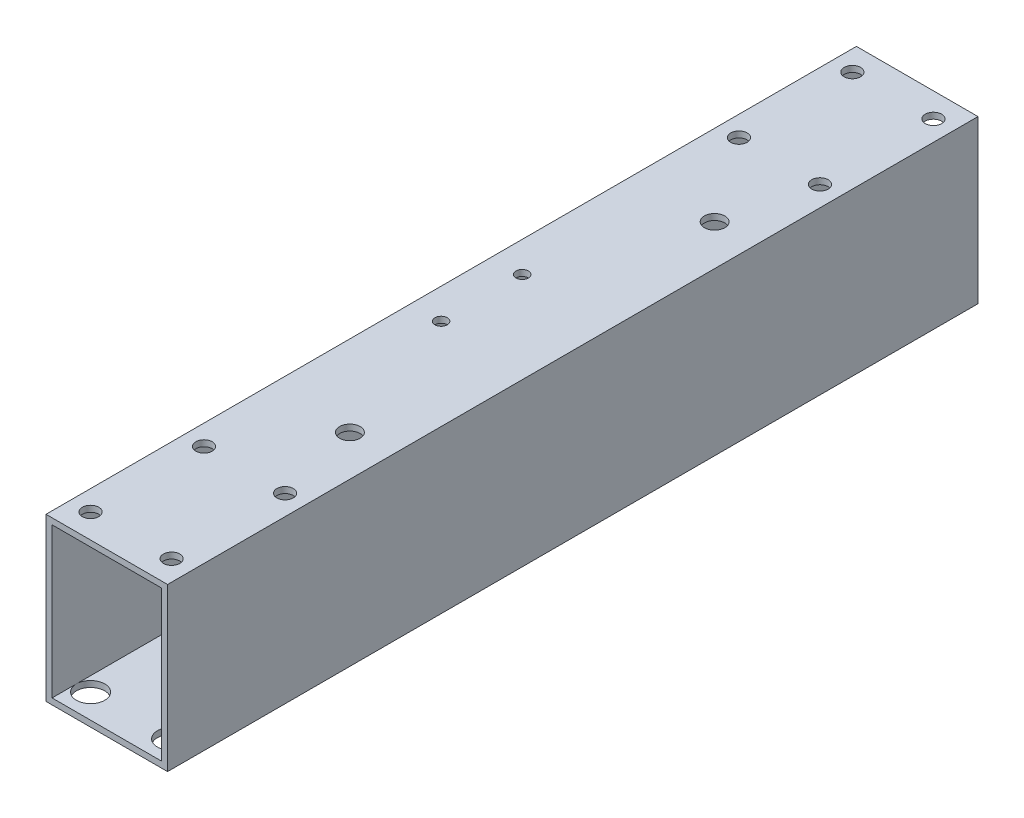
ISO-10303-21;
HEADER;
FILE_DESCRIPTION(('STEP AP214'),'2;1');
FILE_NAME('part.step','',(''),(''),'','','');
FILE_SCHEMA(('AUTOMOTIVE_DESIGN { 1 0 10303 214 1 1 1 1 }'));
ENDSEC;
DATA;
#1=APPLICATION_CONTEXT('core data for automotive mechanical design processes');
#2=APPLICATION_PROTOCOL_DEFINITION('international standard','automotive_design',2000,#1);
#3=PRODUCT_CONTEXT('',#1,'mechanical');
#4=PRODUCT('Part','Part','',(#3));
#5=PRODUCT_RELATED_PRODUCT_CATEGORY('part','',(#4));
#6=PRODUCT_DEFINITION_FORMATION('','',#4);
#7=PRODUCT_DEFINITION_CONTEXT('part definition',#1,'design');
#8=PRODUCT_DEFINITION('design','',#6,#7);
#9=PRODUCT_DEFINITION_SHAPE('','',#8);
#10=(LENGTH_UNIT() NAMED_UNIT(*) SI_UNIT(.MILLI.,.METRE.));
#11=(NAMED_UNIT(*) PLANE_ANGLE_UNIT() SI_UNIT($,.RADIAN.));
#12=(NAMED_UNIT(*) SI_UNIT($,.STERADIAN.) SOLID_ANGLE_UNIT());
#13=UNCERTAINTY_MEASURE_WITH_UNIT(LENGTH_MEASURE(1.E-05),#10,'distance_accuracy_value','');
#14=(GEOMETRIC_REPRESENTATION_CONTEXT(3) GLOBAL_UNCERTAINTY_ASSIGNED_CONTEXT((#13)) GLOBAL_UNIT_ASSIGNED_CONTEXT((#10,
#11,#12)) REPRESENTATION_CONTEXT('',''));
#15=CARTESIAN_POINT('',(0.,0.,0.));
#16=DIRECTION('',(0.,0.,1.));
#17=DIRECTION('',(1.,0.,0.));
#18=AXIS2_PLACEMENT_3D('',#15,#16,#17);
#19=CARTESIAN_POINT('',(0.,0.,100.));
#20=DIRECTION('',(0.,0.,-1.));
#21=DIRECTION('',(-1.,0.,0.));
#22=AXIS2_PLACEMENT_3D('',#19,#20,#21);
#23=PLANE('',#22);
#24=DIRECTION('',(0.,1.,0.));
#25=VECTOR('',#24,1.);
#26=CARTESIAN_POINT('',(15.,-20.,100.));
#27=LINE('',#26,#25);
#28=CARTESIAN_POINT('',(15.,-20.,100.));
#29=VERTEX_POINT('',#28);
#30=CARTESIAN_POINT('',(15.,20.,100.));
#31=VERTEX_POINT('',#30);
#32=EDGE_CURVE('E180',#29,#31,#27,.T.);
#33=ORIENTED_EDGE('',*,*,#32,.T.);
#34=DIRECTION('',(-1.,0.,0.));
#35=VECTOR('',#34,1.);
#36=CARTESIAN_POINT('',(-15.,20.,100.));
#37=LINE('',#36,#35);
#38=CARTESIAN_POINT('',(-15.,20.,100.));
#39=VERTEX_POINT('',#38);
#40=EDGE_CURVE('E183',#31,#39,#37,.T.);
#41=ORIENTED_EDGE('',*,*,#40,.T.);
#42=DIRECTION('',(0.,-1.,0.));
#43=VECTOR('',#42,1.);
#44=CARTESIAN_POINT('',(-15.,-20.,100.));
#45=LINE('',#44,#43);
#46=CARTESIAN_POINT('',(-15.,-20.,100.));
#47=VERTEX_POINT('',#46);
#48=EDGE_CURVE('E186',#39,#47,#45,.T.);
#49=ORIENTED_EDGE('',*,*,#48,.T.);
#50=DIRECTION('',(1.,0.,0.));
#51=VECTOR('',#50,1.);
#52=CARTESIAN_POINT('',(-15.,-20.,100.));
#53=LINE('',#52,#51);
#54=EDGE_CURVE('E188',#47,#29,#53,.T.);
#55=ORIENTED_EDGE('',*,*,#54,.T.);
#56=EDGE_LOOP('',(#33,#41,#49,#55));
#57=FACE_BOUND('',#56,.T.);
#58=DIRECTION('',(1.,0.,0.));
#59=VECTOR('',#58,1.);
#60=CARTESIAN_POINT('',(-13.5,-18.5,100.));
#61=LINE('',#60,#59);
#62=CARTESIAN_POINT('',(-13.5,-18.5,100.));
#63=VERTEX_POINT('',#62);
#64=CARTESIAN_POINT('',(13.5,-18.5,100.));
#65=VERTEX_POINT('',#64);
#66=EDGE_CURVE('E127',#63,#65,#61,.T.);
#67=ORIENTED_EDGE('',*,*,#66,.F.);
#68=DIRECTION('',(0.,-1.,0.));
#69=VECTOR('',#68,1.);
#70=CARTESIAN_POINT('',(-13.5,-18.5,100.));
#71=LINE('',#70,#69);
#72=CARTESIAN_POINT('',(-13.5,18.5,100.));
#73=VERTEX_POINT('',#72);
#74=EDGE_CURVE('E156',#73,#63,#71,.T.);
#75=ORIENTED_EDGE('',*,*,#74,.F.);
#76=DIRECTION('',(-1.,0.,0.));
#77=VECTOR('',#76,1.);
#78=CARTESIAN_POINT('',(-13.5,18.5,100.));
#79=LINE('',#78,#77);
#80=CARTESIAN_POINT('',(13.5,18.5,100.));
#81=VERTEX_POINT('',#80);
#82=EDGE_CURVE('E154',#81,#73,#79,.T.);
#83=ORIENTED_EDGE('',*,*,#82,.F.);
#84=DIRECTION('',(0.,1.,0.));
#85=VECTOR('',#84,1.);
#86=CARTESIAN_POINT('',(13.5,-18.5,100.));
#87=LINE('',#86,#85);
#88=EDGE_CURVE('E139',#65,#81,#87,.T.);
#89=ORIENTED_EDGE('',*,*,#88,.F.);
#90=EDGE_LOOP('',(#67,#75,#83,#89));
#91=FACE_BOUND('',#90,.T.);
#92=ADVANCED_FACE('F37',(#57,#91),#23,.F.);
#93=CARTESIAN_POINT('',(0.,0.,-100.));
#94=DIRECTION('',(0.,0.,-1.));
#95=DIRECTION('',(-1.,0.,0.));
#96=AXIS2_PLACEMENT_3D('',#93,#94,#95);
#97=PLANE('',#96);
#98=DIRECTION('',(0.,1.,0.));
#99=VECTOR('',#98,1.);
#100=CARTESIAN_POINT('',(15.,-20.,-100.));
#101=LINE('',#100,#99);
#102=CARTESIAN_POINT('',(15.,-20.,-100.));
#103=VERTEX_POINT('',#102);
#104=CARTESIAN_POINT('',(15.,20.,-100.));
#105=VERTEX_POINT('',#104);
#106=EDGE_CURVE('E149',#103,#105,#101,.T.);
#107=ORIENTED_EDGE('',*,*,#106,.F.);
#108=DIRECTION('',(1.,0.,0.));
#109=VECTOR('',#108,1.);
#110=CARTESIAN_POINT('',(-15.,-20.,-100.));
#111=LINE('',#110,#109);
#112=CARTESIAN_POINT('',(-15.,-20.,-100.));
#113=VERTEX_POINT('',#112);
#114=EDGE_CURVE('E184',#113,#103,#111,.T.);
#115=ORIENTED_EDGE('',*,*,#114,.F.);
#116=DIRECTION('',(0.,-1.,0.));
#117=VECTOR('',#116,1.);
#118=CARTESIAN_POINT('',(-15.,-20.,-100.));
#119=LINE('',#118,#117);
#120=CARTESIAN_POINT('',(-15.,20.,-100.));
#121=VERTEX_POINT('',#120);
#122=EDGE_CURVE('E195',#121,#113,#119,.T.);
#123=ORIENTED_EDGE('',*,*,#122,.F.);
#124=DIRECTION('',(-1.,0.,0.));
#125=VECTOR('',#124,1.);
#126=CARTESIAN_POINT('',(-15.,20.,-100.));
#127=LINE('',#126,#125);
#128=EDGE_CURVE('E193',#105,#121,#127,.T.);
#129=ORIENTED_EDGE('',*,*,#128,.F.);
#130=EDGE_LOOP('',(#107,#115,#123,#129));
#131=FACE_BOUND('',#130,.T.);
#132=DIRECTION('',(0.,-1.,0.));
#133=VECTOR('',#132,1.);
#134=CARTESIAN_POINT('',(-13.5,-18.5,-100.));
#135=LINE('',#134,#133);
#136=CARTESIAN_POINT('',(-13.5,18.5,-100.));
#137=VERTEX_POINT('',#136);
#138=CARTESIAN_POINT('',(-13.5,-18.5,-100.));
#139=VERTEX_POINT('',#138);
#140=EDGE_CURVE('E140',#137,#139,#135,.T.);
#141=ORIENTED_EDGE('',*,*,#140,.T.);
#142=DIRECTION('',(1.,0.,0.));
#143=VECTOR('',#142,1.);
#144=CARTESIAN_POINT('',(-13.5,-18.5,-100.));
#145=LINE('',#144,#143);
#146=CARTESIAN_POINT('',(13.5,-18.5,-100.));
#147=VERTEX_POINT('',#146);
#148=EDGE_CURVE('E162',#139,#147,#145,.T.);
#149=ORIENTED_EDGE('',*,*,#148,.T.);
#150=DIRECTION('',(0.,1.,0.));
#151=VECTOR('',#150,1.);
#152=CARTESIAN_POINT('',(13.5,-18.5,-100.));
#153=LINE('',#152,#151);
#154=CARTESIAN_POINT('',(13.5,18.5,-100.));
#155=VERTEX_POINT('',#154);
#156=EDGE_CURVE('E165',#147,#155,#153,.T.);
#157=ORIENTED_EDGE('',*,*,#156,.T.);
#158=DIRECTION('',(-1.,0.,0.));
#159=VECTOR('',#158,1.);
#160=CARTESIAN_POINT('',(-13.5,18.5,-100.));
#161=LINE('',#160,#159);
#162=EDGE_CURVE('E169',#155,#137,#161,.T.);
#163=ORIENTED_EDGE('',*,*,#162,.T.);
#164=EDGE_LOOP('',(#141,#149,#157,#163));
#165=FACE_BOUND('',#164,.T.);
#166=ADVANCED_FACE('F271',(#131,#165),#97,.T.);
#167=CARTESIAN_POINT('',(15.,-20.,100.));
#168=DIRECTION('',(-1.,0.,0.));
#169=DIRECTION('',(0.,0.,1.));
#170=AXIS2_PLACEMENT_3D('',#167,#168,#169);
#171=PLANE('',#170);
#172=ORIENTED_EDGE('',*,*,#106,.T.);
#173=DIRECTION('',(0.,0.,-1.));
#174=VECTOR('',#173,1.);
#175=CARTESIAN_POINT('',(15.,20.,100.));
#176=LINE('',#175,#174);
#177=EDGE_CURVE('E11',#31,#105,#176,.T.);
#178=ORIENTED_EDGE('',*,*,#177,.F.);
#179=ORIENTED_EDGE('',*,*,#32,.F.);
#180=DIRECTION('',(0.,0.,-1.));
#181=VECTOR('',#180,1.);
#182=CARTESIAN_POINT('',(15.,-20.,100.));
#183=LINE('',#182,#181);
#184=EDGE_CURVE('E190',#29,#103,#183,.T.);
#185=ORIENTED_EDGE('',*,*,#184,.T.);
#186=EDGE_LOOP('',(#172,#178,#179,#185));
#187=FACE_BOUND('',#186,.T.);
#188=ADVANCED_FACE('F39',(#187),#171,.F.);
#189=CARTESIAN_POINT('',(-15.,20.,100.));
#190=DIRECTION('',(0.,-1.,0.));
#191=DIRECTION('',(0.,0.,-1.));
#192=AXIS2_PLACEMENT_3D('',#189,#190,#191);
#193=PLANE('',#192);
#194=CARTESIAN_POINT('',(10.,20.,-66.));
#195=DIRECTION('',(0.,-1.,0.));
#196=DIRECTION('',(0.,0.,-1.));
#197=AXIS2_PLACEMENT_3D('',#194,#195,#196);
#198=CIRCLE('',#197,2.025);
#199=CARTESIAN_POINT('',(10.,20.,-68.025));
#200=VERTEX_POINT('',#199);
#201=EDGE_CURVE('E233',#200,#200,#198,.T.);
#202=ORIENTED_EDGE('',*,*,#201,.T.);
#203=EDGE_LOOP('',(#202));
#204=FACE_BOUND('',#203,.T.);
#205=CARTESIAN_POINT('',(-10.,20.,66.));
#206=DIRECTION('',(0.,-1.,0.));
#207=DIRECTION('',(0.,0.,-1.));
#208=AXIS2_PLACEMENT_3D('',#205,#206,#207);
#209=CIRCLE('',#208,2.025);
#210=CARTESIAN_POINT('',(-10.,20.,63.975));
#211=VERTEX_POINT('',#210);
#212=EDGE_CURVE('E649',#211,#211,#209,.T.);
#213=ORIENTED_EDGE('',*,*,#212,.T.);
#214=EDGE_LOOP('',(#213));
#215=FACE_BOUND('',#214,.T.);
#216=CARTESIAN_POINT('',(10.,20.,66.));
#217=DIRECTION('',(0.,-1.,0.));
#218=DIRECTION('',(0.,0.,-1.));
#219=AXIS2_PLACEMENT_3D('',#216,#217,#218);
#220=CIRCLE('',#219,2.025);
#221=CARTESIAN_POINT('',(10.,20.,63.975));
#222=VERTEX_POINT('',#221);
#223=EDGE_CURVE('E647',#222,#222,#220,.T.);
#224=ORIENTED_EDGE('',*,*,#223,.T.);
#225=EDGE_LOOP('',(#224));
#226=FACE_BOUND('',#225,.T.);
#227=CARTESIAN_POINT('',(10.,20.,94.));
#228=DIRECTION('',(0.,-1.,0.));
#229=DIRECTION('',(0.,0.,-1.));
#230=AXIS2_PLACEMENT_3D('',#227,#228,#229);
#231=CIRCLE('',#230,2.025);
#232=CARTESIAN_POINT('',(10.,20.,91.975));
#233=VERTEX_POINT('',#232);
#234=EDGE_CURVE('E644',#233,#233,#231,.T.);
#235=ORIENTED_EDGE('',*,*,#234,.T.);
#236=EDGE_LOOP('',(#235));
#237=FACE_BOUND('',#236,.T.);
#238=CARTESIAN_POINT('',(-9.99999999999998,20.,-94.));
#239=DIRECTION('',(0.,-1.,0.));
#240=DIRECTION('',(0.,0.,-1.));
#241=AXIS2_PLACEMENT_3D('',#238,#239,#240);
#242=CIRCLE('',#241,2.025);
#243=CARTESIAN_POINT('',(-9.99999999999998,20.,-96.025));
#244=VERTEX_POINT('',#243);
#245=EDGE_CURVE('E641',#244,#244,#242,.T.);
#246=ORIENTED_EDGE('',*,*,#245,.T.);
#247=EDGE_LOOP('',(#246));
#248=FACE_BOUND('',#247,.T.);
#249=CARTESIAN_POINT('',(10.,20.,-94.));
#250=DIRECTION('',(0.,-1.,0.));
#251=DIRECTION('',(0.,0.,-1.));
#252=AXIS2_PLACEMENT_3D('',#249,#250,#251);
#253=CIRCLE('',#252,2.025);
#254=CARTESIAN_POINT('',(10.,20.,-96.025));
#255=VERTEX_POINT('',#254);
#256=EDGE_CURVE('E638',#255,#255,#253,.T.);
#257=ORIENTED_EDGE('',*,*,#256,.T.);
#258=EDGE_LOOP('',(#257));
#259=FACE_BOUND('',#258,.T.);
#260=CARTESIAN_POINT('',(-9.99999999999998,20.,-66.));
#261=DIRECTION('',(0.,-1.,0.));
#262=DIRECTION('',(0.,0.,-1.));
#263=AXIS2_PLACEMENT_3D('',#260,#261,#262);
#264=CIRCLE('',#263,2.025);
#265=CARTESIAN_POINT('',(-9.99999999999998,20.,-68.025));
#266=VERTEX_POINT('',#265);
#267=EDGE_CURVE('E635',#266,#266,#264,.T.);
#268=ORIENTED_EDGE('',*,*,#267,.T.);
#269=EDGE_LOOP('',(#268));
#270=FACE_BOUND('',#269,.T.);
#271=CARTESIAN_POINT('',(-10.,20.,94.));
#272=DIRECTION('',(0.,-1.,0.));
#273=DIRECTION('',(0.,0.,-1.));
#274=AXIS2_PLACEMENT_3D('',#271,#272,#273);
#275=CIRCLE('',#274,2.025);
#276=CARTESIAN_POINT('',(-10.,20.,91.975));
#277=VERTEX_POINT('',#276);
#278=EDGE_CURVE('E632',#277,#277,#275,.T.);
#279=ORIENTED_EDGE('',*,*,#278,.T.);
#280=EDGE_LOOP('',(#279));
#281=FACE_BOUND('',#280,.T.);
#282=CARTESIAN_POINT('',(5.00000000000001,20.,-45.));
#283=DIRECTION('',(0.,1.,0.));
#284=DIRECTION('',(0.,0.,1.));
#285=AXIS2_PLACEMENT_3D('',#282,#283,#284);
#286=CIRCLE('',#285,2.525);
#287=CARTESIAN_POINT('',(5.00000000000001,20.,-42.475));
#288=VERTEX_POINT('',#287);
#289=EDGE_CURVE('E221',#288,#288,#286,.T.);
#290=ORIENTED_EDGE('',*,*,#289,.F.);
#291=EDGE_LOOP('',(#290));
#292=FACE_BOUND('',#291,.T.);
#293=CARTESIAN_POINT('',(5.00000000000001,20.,45.));
#294=DIRECTION('',(0.,1.,0.));
#295=DIRECTION('',(0.,0.,1.));
#296=AXIS2_PLACEMENT_3D('',#293,#294,#295);
#297=CIRCLE('',#296,2.525);
#298=CARTESIAN_POINT('',(5.00000000000001,20.,47.525));
#299=VERTEX_POINT('',#298);
#300=EDGE_CURVE('E228',#299,#299,#297,.T.);
#301=ORIENTED_EDGE('',*,*,#300,.F.);
#302=EDGE_LOOP('',(#301));
#303=FACE_BOUND('',#302,.T.);
#304=CARTESIAN_POINT('',(-7.5,20.,-10.));
#305=DIRECTION('',(0.,1.,0.));
#306=DIRECTION('',(0.,0.,1.));
#307=AXIS2_PLACEMENT_3D('',#304,#305,#306);
#308=CIRCLE('',#307,1.525);
#309=CARTESIAN_POINT('',(-7.5,20.,-8.475));
#310=VERTEX_POINT('',#309);
#311=EDGE_CURVE('E208',#310,#310,#308,.T.);
#312=ORIENTED_EDGE('',*,*,#311,.F.);
#313=EDGE_LOOP('',(#312));
#314=FACE_BOUND('',#313,.T.);
#315=CARTESIAN_POINT('',(-7.49999999999999,20.,10.));
#316=DIRECTION('',(0.,1.,0.));
#317=DIRECTION('',(0.,0.,1.));
#318=AXIS2_PLACEMENT_3D('',#315,#316,#317);
#319=CIRCLE('',#318,1.525);
#320=CARTESIAN_POINT('',(-7.49999999999999,20.,11.525));
#321=VERTEX_POINT('',#320);
#322=EDGE_CURVE('E217',#321,#321,#319,.T.);
#323=ORIENTED_EDGE('',*,*,#322,.F.);
#324=EDGE_LOOP('',(#323));
#325=FACE_BOUND('',#324,.T.);
#326=ORIENTED_EDGE('',*,*,#128,.T.);
#327=DIRECTION('',(0.,0.,-1.));
#328=VECTOR('',#327,1.);
#329=CARTESIAN_POINT('',(-15.,20.,100.));
#330=LINE('',#329,#328);
#331=EDGE_CURVE('E46',#39,#121,#330,.T.);
#332=ORIENTED_EDGE('',*,*,#331,.F.);
#333=ORIENTED_EDGE('',*,*,#40,.F.);
#334=ORIENTED_EDGE('',*,*,#177,.T.);
#335=EDGE_LOOP('',(#326,#332,#333,#334));
#336=FACE_BOUND('',#335,.T.);
#337=ADVANCED_FACE('F257',(#204,#215,#226,#237,#248,#259,#270,#281,#292,#303,#314,#325,#336),
#193,.F.);
#338=CARTESIAN_POINT('',(-15.,-20.,100.));
#339=DIRECTION('',(1.,0.,0.));
#340=DIRECTION('',(0.,0.,-1.));
#341=AXIS2_PLACEMENT_3D('',#338,#339,#340);
#342=PLANE('',#341);
#343=ORIENTED_EDGE('',*,*,#122,.T.);
#344=DIRECTION('',(0.,0.,-1.));
#345=VECTOR('',#344,1.);
#346=CARTESIAN_POINT('',(-15.,-20.,100.));
#347=LINE('',#346,#345);
#348=EDGE_CURVE('E200',#47,#113,#347,.T.);
#349=ORIENTED_EDGE('',*,*,#348,.F.);
#350=ORIENTED_EDGE('',*,*,#48,.F.);
#351=ORIENTED_EDGE('',*,*,#331,.T.);
#352=EDGE_LOOP('',(#343,#349,#350,#351));
#353=FACE_BOUND('',#352,.T.);
#354=ADVANCED_FACE('F260',(#353),#342,.F.);
#355=CARTESIAN_POINT('',(-15.,-20.,100.));
#356=DIRECTION('',(0.,1.,0.));
#357=DIRECTION('',(0.,0.,1.));
#358=AXIS2_PLACEMENT_3D('',#355,#356,#357);
#359=PLANE('',#358);
#360=CARTESIAN_POINT('',(10.,-20.,66.));
#361=DIRECTION('',(0.,1.,0.));
#362=DIRECTION('',(0.,0.,1.));
#363=AXIS2_PLACEMENT_3D('',#360,#361,#362);
#364=CIRCLE('',#363,3.5);
#365=CARTESIAN_POINT('',(10.,-20.,69.5));
#366=VERTEX_POINT('',#365);
#367=EDGE_CURVE('E602',#366,#366,#364,.F.);
#368=ORIENTED_EDGE('',*,*,#367,.F.);
#369=EDGE_LOOP('',(#368));
#370=FACE_BOUND('',#369,.T.);
#371=CARTESIAN_POINT('',(-9.99999999999998,-20.,-66.));
#372=DIRECTION('',(0.,1.,0.));
#373=DIRECTION('',(0.,0.,1.));
#374=AXIS2_PLACEMENT_3D('',#371,#372,#373);
#375=CIRCLE('',#374,3.5);
#376=CARTESIAN_POINT('',(-9.99999999999998,-20.,-62.5));
#377=VERTEX_POINT('',#376);
#378=EDGE_CURVE('E704',#377,#377,#375,.F.);
#379=ORIENTED_EDGE('',*,*,#378,.F.);
#380=EDGE_LOOP('',(#379));
#381=FACE_BOUND('',#380,.T.);
#382=CARTESIAN_POINT('',(10.,-20.,-66.));
#383=DIRECTION('',(0.,1.,0.));
#384=DIRECTION('',(0.,0.,1.));
#385=AXIS2_PLACEMENT_3D('',#382,#383,#384);
#386=CIRCLE('',#385,3.5);
#387=CARTESIAN_POINT('',(10.,-20.,-62.5));
#388=VERTEX_POINT('',#387);
#389=EDGE_CURVE('E608',#388,#388,#386,.F.);
#390=ORIENTED_EDGE('',*,*,#389,.F.);
#391=EDGE_LOOP('',(#390));
#392=FACE_BOUND('',#391,.T.);
#393=CARTESIAN_POINT('',(10.,-20.,-94.));
#394=DIRECTION('',(0.,1.,0.));
#395=DIRECTION('',(0.,0.,1.));
#396=AXIS2_PLACEMENT_3D('',#393,#394,#395);
#397=CIRCLE('',#396,3.5);
#398=CARTESIAN_POINT('',(10.,-20.,-90.5));
#399=VERTEX_POINT('',#398);
#400=EDGE_CURVE('E714',#399,#399,#397,.F.);
#401=ORIENTED_EDGE('',*,*,#400,.F.);
#402=EDGE_LOOP('',(#401));
#403=FACE_BOUND('',#402,.T.);
#404=CARTESIAN_POINT('',(-10.,-20.,66.));
#405=DIRECTION('',(0.,1.,0.));
#406=DIRECTION('',(0.,0.,1.));
#407=AXIS2_PLACEMENT_3D('',#404,#405,#406);
#408=CIRCLE('',#407,3.5);
#409=CARTESIAN_POINT('',(-10.,-20.,69.5));
#410=VERTEX_POINT('',#409);
#411=EDGE_CURVE('E727',#410,#410,#408,.F.);
#412=ORIENTED_EDGE('',*,*,#411,.F.);
#413=EDGE_LOOP('',(#412));
#414=FACE_BOUND('',#413,.T.);
#415=CARTESIAN_POINT('',(-10.,-20.,94.));
#416=DIRECTION('',(0.,1.,0.));
#417=DIRECTION('',(0.,0.,1.));
#418=AXIS2_PLACEMENT_3D('',#415,#416,#417);
#419=CIRCLE('',#418,3.5);
#420=CARTESIAN_POINT('',(-10.,-20.,97.5));
#421=VERTEX_POINT('',#420);
#422=EDGE_CURVE('E731',#421,#421,#419,.F.);
#423=ORIENTED_EDGE('',*,*,#422,.F.);
#424=EDGE_LOOP('',(#423));
#425=FACE_BOUND('',#424,.T.);
#426=CARTESIAN_POINT('',(10.,-20.,94.));
#427=DIRECTION('',(0.,1.,0.));
#428=DIRECTION('',(0.,0.,1.));
#429=AXIS2_PLACEMENT_3D('',#426,#427,#428);
#430=CIRCLE('',#429,3.5);
#431=CARTESIAN_POINT('',(10.,-20.,97.5));
#432=VERTEX_POINT('',#431);
#433=EDGE_CURVE('E703',#432,#432,#430,.F.);
#434=ORIENTED_EDGE('',*,*,#433,.F.);
#435=EDGE_LOOP('',(#434));
#436=FACE_BOUND('',#435,.T.);
#437=CARTESIAN_POINT('',(-9.99999999999998,-20.,-94.));
#438=DIRECTION('',(0.,1.,0.));
#439=DIRECTION('',(0.,0.,1.));
#440=AXIS2_PLACEMENT_3D('',#437,#438,#439);
#441=CIRCLE('',#440,3.5);
#442=CARTESIAN_POINT('',(-9.99999999999998,-20.,-90.5));
#443=VERTEX_POINT('',#442);
#444=EDGE_CURVE('E737',#443,#443,#441,.F.);
#445=ORIENTED_EDGE('',*,*,#444,.F.);
#446=EDGE_LOOP('',(#445));
#447=FACE_BOUND('',#446,.T.);
#448=CARTESIAN_POINT('',(5.00000000000001,-20.,-45.));
#449=DIRECTION('',(0.,1.,0.));
#450=DIRECTION('',(0.,0.,1.));
#451=AXIS2_PLACEMENT_3D('',#448,#449,#450);
#452=CIRCLE('',#451,2.525);
#453=CARTESIAN_POINT('',(5.00000000000001,-20.,-42.475));
#454=VERTEX_POINT('',#453);
#455=EDGE_CURVE('E243',#454,#454,#452,.T.);
#456=ORIENTED_EDGE('',*,*,#455,.T.);
#457=EDGE_LOOP('',(#456));
#458=FACE_BOUND('',#457,.T.);
#459=CARTESIAN_POINT('',(5.00000000000001,-20.,45.));
#460=DIRECTION('',(0.,1.,0.));
#461=DIRECTION('',(0.,0.,1.));
#462=AXIS2_PLACEMENT_3D('',#459,#460,#461);
#463=CIRCLE('',#462,2.525);
#464=CARTESIAN_POINT('',(5.00000000000001,-20.,47.525));
#465=VERTEX_POINT('',#464);
#466=EDGE_CURVE('E225',#465,#465,#463,.T.);
#467=ORIENTED_EDGE('',*,*,#466,.T.);
#468=EDGE_LOOP('',(#467));
#469=FACE_BOUND('',#468,.T.);
#470=CARTESIAN_POINT('',(-7.49999999999999,-20.,10.));
#471=DIRECTION('',(0.,-1.,0.));
#472=DIRECTION('',(0.,0.,-1.));
#473=AXIS2_PLACEMENT_3D('',#470,#471,#472);
#474=CIRCLE('',#473,3.15);
#475=CARTESIAN_POINT('',(-7.49999999999999,-20.,6.85));
#476=VERTEX_POINT('',#475);
#477=EDGE_CURVE('E215',#476,#476,#474,.T.);
#478=ORIENTED_EDGE('',*,*,#477,.F.);
#479=EDGE_LOOP('',(#478));
#480=FACE_BOUND('',#479,.T.);
#481=CARTESIAN_POINT('',(-7.5,-20.,-10.));
#482=DIRECTION('',(0.,-1.,0.));
#483=DIRECTION('',(0.,0.,-1.));
#484=AXIS2_PLACEMENT_3D('',#481,#482,#483);
#485=CIRCLE('',#484,3.15);
#486=CARTESIAN_POINT('',(-7.5,-20.,-13.15));
#487=VERTEX_POINT('',#486);
#488=EDGE_CURVE('E246',#487,#487,#485,.T.);
#489=ORIENTED_EDGE('',*,*,#488,.F.);
#490=EDGE_LOOP('',(#489));
#491=FACE_BOUND('',#490,.T.);
#492=ORIENTED_EDGE('',*,*,#114,.T.);
#493=ORIENTED_EDGE('',*,*,#184,.F.);
#494=ORIENTED_EDGE('',*,*,#54,.F.);
#495=ORIENTED_EDGE('',*,*,#348,.T.);
#496=EDGE_LOOP('',(#492,#493,#494,#495));
#497=FACE_BOUND('',#496,.T.);
#498=ADVANCED_FACE('F275',(#370,#381,#392,#403,#414,#425,#436,#447,#458,#469,#480,#491,#497),
#359,.F.);
#499=CARTESIAN_POINT('',(-13.5,-18.5,100.));
#500=DIRECTION('',(0.,1.,0.));
#501=DIRECTION('',(0.,0.,1.));
#502=AXIS2_PLACEMENT_3D('',#499,#500,#501);
#503=PLANE('',#502);
#504=CARTESIAN_POINT('',(5.00000000000001,-18.5,-45.));
#505=DIRECTION('',(0.,1.,0.));
#506=DIRECTION('',(0.,0.,1.));
#507=AXIS2_PLACEMENT_3D('',#504,#505,#506);
#508=CIRCLE('',#507,2.525);
#509=CARTESIAN_POINT('',(5.00000000000001,-18.5,-42.475));
#510=VERTEX_POINT('',#509);
#511=EDGE_CURVE('E240',#510,#510,#508,.T.);
#512=ORIENTED_EDGE('',*,*,#511,.F.);
#513=EDGE_LOOP('',(#512));
#514=FACE_BOUND('',#513,.T.);
#515=CARTESIAN_POINT('',(5.00000000000001,-18.5,45.));
#516=DIRECTION('',(0.,1.,0.));
#517=DIRECTION('',(0.,0.,1.));
#518=AXIS2_PLACEMENT_3D('',#515,#516,#517);
#519=CIRCLE('',#518,2.525);
#520=CARTESIAN_POINT('',(5.00000000000001,-18.5,47.525));
#521=VERTEX_POINT('',#520);
#522=EDGE_CURVE('E220',#521,#521,#519,.T.);
#523=ORIENTED_EDGE('',*,*,#522,.F.);
#524=EDGE_LOOP('',(#523));
#525=FACE_BOUND('',#524,.T.);
#526=CARTESIAN_POINT('',(-7.49999999999999,-18.5,10.));
#527=DIRECTION('',(0.,1.,0.));
#528=DIRECTION('',(0.,0.,1.));
#529=AXIS2_PLACEMENT_3D('',#526,#527,#528);
#530=CIRCLE('',#529,3.15);
#531=CARTESIAN_POINT('',(-7.49999999999999,-18.5,13.15));
#532=VERTEX_POINT('',#531);
#533=EDGE_CURVE('E214',#532,#532,#530,.T.);
#534=ORIENTED_EDGE('',*,*,#533,.F.);
#535=EDGE_LOOP('',(#534));
#536=FACE_BOUND('',#535,.T.);
#537=CARTESIAN_POINT('',(-7.5,-18.5,-10.));
#538=DIRECTION('',(0.,1.,0.));
#539=DIRECTION('',(0.,0.,1.));
#540=AXIS2_PLACEMENT_3D('',#537,#538,#539);
#541=CIRCLE('',#540,3.15);
#542=CARTESIAN_POINT('',(-7.5,-18.5,-6.85));
#543=VERTEX_POINT('',#542);
#544=EDGE_CURVE('E211',#543,#543,#541,.T.);
#545=ORIENTED_EDGE('',*,*,#544,.F.);
#546=EDGE_LOOP('',(#545));
#547=FACE_BOUND('',#546,.T.);
#548=DIRECTION('',(0.,0.,-1.));
#549=VECTOR('',#548,1.);
#550=CARTESIAN_POINT('',(13.5,-18.5,100.));
#551=LINE('',#550,#549);
#552=CARTESIAN_POINT('',(13.5,-18.5,94.));
#553=VERTEX_POINT('',#552);
#554=CARTESIAN_POINT('',(13.5,-18.5,66.));
#555=VERTEX_POINT('',#554);
#556=EDGE_CURVE('E148',#553,#555,#551,.T.);
#557=ORIENTED_EDGE('',*,*,#556,.T.);
#558=CARTESIAN_POINT('',(10.,-18.5,66.));
#559=DIRECTION('',(0.,1.,0.));
#560=DIRECTION('',(0.,0.,1.));
#561=AXIS2_PLACEMENT_3D('',#558,#559,#560);
#562=CIRCLE('',#561,3.5);
#563=EDGE_CURVE('E599',#555,#555,#562,.F.);
#564=ORIENTED_EDGE('',*,*,#563,.T.);
#565=CARTESIAN_POINT('',(13.5,-18.5,-66.));
#566=VERTEX_POINT('',#565);
#567=EDGE_CURVE('E701',#555,#566,#551,.T.);
#568=ORIENTED_EDGE('',*,*,#567,.T.);
#569=CARTESIAN_POINT('',(10.,-18.5,-66.));
#570=DIRECTION('',(0.,1.,0.));
#571=DIRECTION('',(0.,0.,1.));
#572=AXIS2_PLACEMENT_3D('',#569,#570,#571);
#573=CIRCLE('',#572,3.5);
#574=EDGE_CURVE('E57',#566,#566,#573,.F.);
#575=ORIENTED_EDGE('',*,*,#574,.T.);
#576=CARTESIAN_POINT('',(13.5,-18.5,-94.));
#577=VERTEX_POINT('',#576);
#578=EDGE_CURVE('E699',#566,#577,#551,.T.);
#579=ORIENTED_EDGE('',*,*,#578,.T.);
#580=CARTESIAN_POINT('',(10.,-18.5,-94.));
#581=DIRECTION('',(0.,1.,0.));
#582=DIRECTION('',(0.,0.,1.));
#583=AXIS2_PLACEMENT_3D('',#580,#581,#582);
#584=CIRCLE('',#583,3.5);
#585=EDGE_CURVE('E52',#577,#577,#584,.F.);
#586=ORIENTED_EDGE('',*,*,#585,.T.);
#587=EDGE_CURVE('E151',#577,#147,#551,.T.);
#588=ORIENTED_EDGE('',*,*,#587,.T.);
#589=ORIENTED_EDGE('',*,*,#148,.F.);
#590=DIRECTION('',(0.,0.,-1.));
#591=VECTOR('',#590,1.);
#592=CARTESIAN_POINT('',(-13.5,-18.5,100.));
#593=LINE('',#592,#591);
#594=CARTESIAN_POINT('',(-13.5,-18.5,-94.));
#595=VERTEX_POINT('',#594);
#596=EDGE_CURVE('E161',#595,#139,#593,.T.);
#597=ORIENTED_EDGE('',*,*,#596,.F.);
#598=CARTESIAN_POINT('',(-9.99999999999998,-18.5,-94.));
#599=DIRECTION('',(0.,1.,0.));
#600=DIRECTION('',(0.,0.,1.));
#601=AXIS2_PLACEMENT_3D('',#598,#599,#600);
#602=CIRCLE('',#601,3.5);
#603=EDGE_CURVE('E751',#595,#595,#602,.F.);
#604=ORIENTED_EDGE('',*,*,#603,.T.);
#605=CARTESIAN_POINT('',(-13.5,-18.5,-66.));
#606=VERTEX_POINT('',#605);
#607=EDGE_CURVE('E768',#606,#595,#593,.T.);
#608=ORIENTED_EDGE('',*,*,#607,.F.);
#609=CARTESIAN_POINT('',(-9.99999999999998,-18.5,-66.));
#610=DIRECTION('',(0.,1.,0.));
#611=DIRECTION('',(0.,0.,1.));
#612=AXIS2_PLACEMENT_3D('',#609,#610,#611);
#613=CIRCLE('',#612,3.5);
#614=EDGE_CURVE('E709',#606,#606,#613,.F.);
#615=ORIENTED_EDGE('',*,*,#614,.T.);
#616=CARTESIAN_POINT('',(-13.5,-18.5,66.));
#617=VERTEX_POINT('',#616);
#618=EDGE_CURVE('E765',#617,#606,#593,.T.);
#619=ORIENTED_EDGE('',*,*,#618,.F.);
#620=CARTESIAN_POINT('',(-10.,-18.5,66.));
#621=DIRECTION('',(0.,1.,0.));
#622=DIRECTION('',(0.,0.,1.));
#623=AXIS2_PLACEMENT_3D('',#620,#621,#622);
#624=CIRCLE('',#623,3.5);
#625=EDGE_CURVE('E758',#617,#617,#624,.F.);
#626=ORIENTED_EDGE('',*,*,#625,.T.);
#627=CARTESIAN_POINT('',(-13.5,-18.5,94.));
#628=VERTEX_POINT('',#627);
#629=EDGE_CURVE('E176',#628,#617,#593,.T.);
#630=ORIENTED_EDGE('',*,*,#629,.F.);
#631=CARTESIAN_POINT('',(-10.,-18.5,94.));
#632=DIRECTION('',(0.,1.,0.));
#633=DIRECTION('',(0.,0.,1.));
#634=AXIS2_PLACEMENT_3D('',#631,#632,#633);
#635=CIRCLE('',#634,3.5);
#636=EDGE_CURVE('E750',#628,#628,#635,.F.);
#637=ORIENTED_EDGE('',*,*,#636,.T.);
#638=EDGE_CURVE('E135',#63,#628,#593,.T.);
#639=ORIENTED_EDGE('',*,*,#638,.F.);
#640=ORIENTED_EDGE('',*,*,#66,.T.);
#641=EDGE_CURVE('E132',#65,#553,#551,.T.);
#642=ORIENTED_EDGE('',*,*,#641,.T.);
#643=CARTESIAN_POINT('',(10.,-18.5,94.));
#644=DIRECTION('',(0.,1.,0.));
#645=DIRECTION('',(0.,0.,1.));
#646=AXIS2_PLACEMENT_3D('',#643,#644,#645);
#647=CIRCLE('',#646,3.5);
#648=EDGE_CURVE('E702',#553,#553,#647,.F.);
#649=ORIENTED_EDGE('',*,*,#648,.T.);
#650=EDGE_LOOP('',(#557,#564,#568,#575,#579,#586,#588,#589,#597,#604,#608,#615,#619,#626,#630,
#637,#639,#640,#642,#649));
#651=FACE_BOUND('',#650,.T.);
#652=ADVANCED_FACE('F130',(#514,#525,#536,#547,#651),#503,.T.);
#653=CARTESIAN_POINT('',(13.5,-18.5,100.));
#654=DIRECTION('',(-1.,0.,0.));
#655=DIRECTION('',(0.,-1.,0.));
#656=AXIS2_PLACEMENT_3D('',#653,#654,#655);
#657=PLANE('',#656);
#658=ORIENTED_EDGE('',*,*,#156,.F.);
#659=ORIENTED_EDGE('',*,*,#587,.F.);
#660=ORIENTED_EDGE('',*,*,#578,.F.);
#661=ORIENTED_EDGE('',*,*,#567,.F.);
#662=ORIENTED_EDGE('',*,*,#556,.F.);
#663=ORIENTED_EDGE('',*,*,#641,.F.);
#664=ORIENTED_EDGE('',*,*,#88,.T.);
#665=DIRECTION('',(0.,0.,-1.));
#666=VECTOR('',#665,1.);
#667=CARTESIAN_POINT('',(13.5,18.5,100.));
#668=LINE('',#667,#666);
#669=EDGE_CURVE('E178',#81,#155,#668,.T.);
#670=ORIENTED_EDGE('',*,*,#669,.T.);
#671=EDGE_LOOP('',(#658,#659,#660,#661,#662,#663,#664,#670));
#672=FACE_BOUND('',#671,.T.);
#673=ADVANCED_FACE('F145',(#672),#657,.T.);
#674=CARTESIAN_POINT('',(-13.5,18.5,100.));
#675=DIRECTION('',(0.,-1.,0.));
#676=DIRECTION('',(0.,0.,-1.));
#677=AXIS2_PLACEMENT_3D('',#674,#675,#676);
#678=PLANE('',#677);
#679=CARTESIAN_POINT('',(10.,18.5,-66.));
#680=DIRECTION('',(0.,-1.,0.));
#681=DIRECTION('',(0.,0.,-1.));
#682=AXIS2_PLACEMENT_3D('',#679,#680,#681);
#683=CIRCLE('',#682,2.025);
#684=CARTESIAN_POINT('',(10.,18.5,-68.025));
#685=VERTEX_POINT('',#684);
#686=EDGE_CURVE('E615',#685,#685,#683,.T.);
#687=ORIENTED_EDGE('',*,*,#686,.F.);
#688=EDGE_LOOP('',(#687));
#689=FACE_BOUND('',#688,.T.);
#690=CARTESIAN_POINT('',(-10.,18.5,66.));
#691=DIRECTION('',(0.,-1.,0.));
#692=DIRECTION('',(0.,0.,-1.));
#693=AXIS2_PLACEMENT_3D('',#690,#691,#692);
#694=CIRCLE('',#693,2.025);
#695=CARTESIAN_POINT('',(-10.,18.5,63.975));
#696=VERTEX_POINT('',#695);
#697=EDGE_CURVE('E618',#696,#696,#694,.T.);
#698=ORIENTED_EDGE('',*,*,#697,.F.);
#699=EDGE_LOOP('',(#698));
#700=FACE_BOUND('',#699,.T.);
#701=CARTESIAN_POINT('',(10.,18.5,66.));
#702=DIRECTION('',(0.,-1.,0.));
#703=DIRECTION('',(0.,0.,-1.));
#704=AXIS2_PLACEMENT_3D('',#701,#702,#703);
#705=CIRCLE('',#704,2.025);
#706=CARTESIAN_POINT('',(10.,18.5,63.975));
#707=VERTEX_POINT('',#706);
#708=EDGE_CURVE('E621',#707,#707,#705,.T.);
#709=ORIENTED_EDGE('',*,*,#708,.F.);
#710=EDGE_LOOP('',(#709));
#711=FACE_BOUND('',#710,.T.);
#712=CARTESIAN_POINT('',(10.,18.5,94.));
#713=DIRECTION('',(0.,-1.,0.));
#714=DIRECTION('',(0.,0.,-1.));
#715=AXIS2_PLACEMENT_3D('',#712,#713,#714);
#716=CIRCLE('',#715,2.025);
#717=CARTESIAN_POINT('',(10.,18.5,91.975));
#718=VERTEX_POINT('',#717);
#719=EDGE_CURVE('E624',#718,#718,#716,.T.);
#720=ORIENTED_EDGE('',*,*,#719,.F.);
#721=EDGE_LOOP('',(#720));
#722=FACE_BOUND('',#721,.T.);
#723=CARTESIAN_POINT('',(-9.99999999999998,18.5,-94.));
#724=DIRECTION('',(0.,-1.,0.));
#725=DIRECTION('',(0.,0.,-1.));
#726=AXIS2_PLACEMENT_3D('',#723,#724,#725);
#727=CIRCLE('',#726,2.025);
#728=CARTESIAN_POINT('',(-9.99999999999998,18.5,-96.025));
#729=VERTEX_POINT('',#728);
#730=EDGE_CURVE('E603',#729,#729,#727,.T.);
#731=ORIENTED_EDGE('',*,*,#730,.F.);
#732=EDGE_LOOP('',(#731));
#733=FACE_BOUND('',#732,.T.);
#734=CARTESIAN_POINT('',(10.,18.5,-94.));
#735=DIRECTION('',(0.,-1.,0.));
#736=DIRECTION('',(0.,0.,-1.));
#737=AXIS2_PLACEMENT_3D('',#734,#735,#736);
#738=CIRCLE('',#737,2.025);
#739=CARTESIAN_POINT('',(10.,18.5,-96.025));
#740=VERTEX_POINT('',#739);
#741=EDGE_CURVE('E606',#740,#740,#738,.T.);
#742=ORIENTED_EDGE('',*,*,#741,.F.);
#743=EDGE_LOOP('',(#742));
#744=FACE_BOUND('',#743,.T.);
#745=CARTESIAN_POINT('',(-9.99999999999998,18.5,-66.));
#746=DIRECTION('',(0.,-1.,0.));
#747=DIRECTION('',(0.,0.,-1.));
#748=AXIS2_PLACEMENT_3D('',#745,#746,#747);
#749=CIRCLE('',#748,2.025);
#750=CARTESIAN_POINT('',(-9.99999999999998,18.5,-68.025));
#751=VERTEX_POINT('',#750);
#752=EDGE_CURVE('E612',#751,#751,#749,.T.);
#753=ORIENTED_EDGE('',*,*,#752,.F.);
#754=EDGE_LOOP('',(#753));
#755=FACE_BOUND('',#754,.T.);
#756=CARTESIAN_POINT('',(-10.,18.5,94.));
#757=DIRECTION('',(0.,-1.,0.));
#758=DIRECTION('',(0.,0.,-1.));
#759=AXIS2_PLACEMENT_3D('',#756,#757,#758);
#760=CIRCLE('',#759,2.025);
#761=CARTESIAN_POINT('',(-10.,18.5,91.975));
#762=VERTEX_POINT('',#761);
#763=EDGE_CURVE('E627',#762,#762,#760,.T.);
#764=ORIENTED_EDGE('',*,*,#763,.F.);
#765=EDGE_LOOP('',(#764));
#766=FACE_BOUND('',#765,.T.);
#767=CARTESIAN_POINT('',(5.00000000000001,18.5,-45.));
#768=DIRECTION('',(0.,-1.,0.));
#769=DIRECTION('',(0.,0.,-1.));
#770=AXIS2_PLACEMENT_3D('',#767,#768,#769);
#771=CIRCLE('',#770,2.525);
#772=CARTESIAN_POINT('',(5.00000000000001,18.5,-47.525));
#773=VERTEX_POINT('',#772);
#774=EDGE_CURVE('E41',#773,#773,#771,.T.);
#775=ORIENTED_EDGE('',*,*,#774,.F.);
#776=EDGE_LOOP('',(#775));
#777=FACE_BOUND('',#776,.T.);
#778=CARTESIAN_POINT('',(5.00000000000001,18.5,45.));
#779=DIRECTION('',(0.,-1.,0.));
#780=DIRECTION('',(0.,0.,-1.));
#781=AXIS2_PLACEMENT_3D('',#778,#779,#780);
#782=CIRCLE('',#781,2.525);
#783=CARTESIAN_POINT('',(5.00000000000001,18.5,42.475));
#784=VERTEX_POINT('',#783);
#785=EDGE_CURVE('E218',#784,#784,#782,.T.);
#786=ORIENTED_EDGE('',*,*,#785,.F.);
#787=EDGE_LOOP('',(#786));
#788=FACE_BOUND('',#787,.T.);
#789=CARTESIAN_POINT('',(-7.5,18.5,-10.));
#790=DIRECTION('',(0.,-1.,0.));
#791=DIRECTION('',(0.,0.,-1.));
#792=AXIS2_PLACEMENT_3D('',#789,#790,#791);
#793=CIRCLE('',#792,1.525);
#794=CARTESIAN_POINT('',(-7.5,18.5,-11.525));
#795=VERTEX_POINT('',#794);
#796=EDGE_CURVE('E166',#795,#795,#793,.T.);
#797=ORIENTED_EDGE('',*,*,#796,.F.);
#798=EDGE_LOOP('',(#797));
#799=FACE_BOUND('',#798,.T.);
#800=CARTESIAN_POINT('',(-7.49999999999999,18.5,10.));
#801=DIRECTION('',(0.,-1.,0.));
#802=DIRECTION('',(0.,0.,-1.));
#803=AXIS2_PLACEMENT_3D('',#800,#801,#802);
#804=CIRCLE('',#803,1.525);
#805=CARTESIAN_POINT('',(-7.49999999999999,18.5,8.475));
#806=VERTEX_POINT('',#805);
#807=EDGE_CURVE('E205',#806,#806,#804,.T.);
#808=ORIENTED_EDGE('',*,*,#807,.F.);
#809=EDGE_LOOP('',(#808));
#810=FACE_BOUND('',#809,.T.);
#811=ORIENTED_EDGE('',*,*,#162,.F.);
#812=ORIENTED_EDGE('',*,*,#669,.F.);
#813=ORIENTED_EDGE('',*,*,#82,.T.);
#814=DIRECTION('',(0.,0.,-1.));
#815=VECTOR('',#814,1.);
#816=CARTESIAN_POINT('',(-13.5,18.5,100.));
#817=LINE('',#816,#815);
#818=EDGE_CURVE('E175',#73,#137,#817,.T.);
#819=ORIENTED_EDGE('',*,*,#818,.T.);
#820=EDGE_LOOP('',(#811,#812,#813,#819));
#821=FACE_BOUND('',#820,.T.);
#822=ADVANCED_FACE('F317',(#689,#700,#711,#722,#733,#744,#755,#766,#777,#788,#799,#810,#821),
#678,.T.);
#823=CARTESIAN_POINT('',(-13.5,-18.5,100.));
#824=DIRECTION('',(1.,0.,0.));
#825=DIRECTION('',(0.,0.,-1.));
#826=AXIS2_PLACEMENT_3D('',#823,#824,#825);
#827=PLANE('',#826);
#828=ORIENTED_EDGE('',*,*,#140,.F.);
#829=ORIENTED_EDGE('',*,*,#818,.F.);
#830=ORIENTED_EDGE('',*,*,#74,.T.);
#831=ORIENTED_EDGE('',*,*,#638,.T.);
#832=ORIENTED_EDGE('',*,*,#629,.T.);
#833=ORIENTED_EDGE('',*,*,#618,.T.);
#834=ORIENTED_EDGE('',*,*,#607,.T.);
#835=ORIENTED_EDGE('',*,*,#596,.T.);
#836=EDGE_LOOP('',(#828,#829,#830,#831,#832,#833,#834,#835));
#837=FACE_BOUND('',#836,.T.);
#838=ADVANCED_FACE('F324',(#837),#827,.T.);
#839=CARTESIAN_POINT('',(-7.49999999999999,-30.,10.));
#840=DIRECTION('',(0.,1.,0.));
#841=DIRECTION('',(0.,0.,1.));
#842=AXIS2_PLACEMENT_3D('',#839,#840,#841);
#843=CYLINDRICAL_SURFACE('',#842,1.525);
#844=ORIENTED_EDGE('',*,*,#807,.T.);
#845=EDGE_LOOP('',(#844));
#846=FACE_BOUND('',#845,.T.);
#847=ORIENTED_EDGE('',*,*,#322,.T.);
#848=EDGE_LOOP('',(#847));
#849=FACE_BOUND('',#848,.T.);
#850=ADVANCED_FACE('F255',(#846,#849),#843,.F.);
#851=CARTESIAN_POINT('',(-7.5,-30.,-10.));
#852=DIRECTION('',(0.,1.,0.));
#853=DIRECTION('',(0.,0.,1.));
#854=AXIS2_PLACEMENT_3D('',#851,#852,#853);
#855=CYLINDRICAL_SURFACE('',#854,1.525);
#856=ORIENTED_EDGE('',*,*,#796,.T.);
#857=EDGE_LOOP('',(#856));
#858=FACE_BOUND('',#857,.T.);
#859=ORIENTED_EDGE('',*,*,#311,.T.);
#860=EDGE_LOOP('',(#859));
#861=FACE_BOUND('',#860,.T.);
#862=ADVANCED_FACE('F339',(#858,#861),#855,.F.);
#863=CARTESIAN_POINT('',(-7.5,-17.,-10.));
#864=DIRECTION('',(0.,-1.,0.));
#865=DIRECTION('',(0.,0.,-1.));
#866=AXIS2_PLACEMENT_3D('',#863,#864,#865);
#867=CYLINDRICAL_SURFACE('',#866,3.15);
#868=ORIENTED_EDGE('',*,*,#544,.T.);
#869=EDGE_LOOP('',(#868));
#870=FACE_BOUND('',#869,.T.);
#871=ORIENTED_EDGE('',*,*,#488,.T.);
#872=EDGE_LOOP('',(#871));
#873=FACE_BOUND('',#872,.T.);
#874=ADVANCED_FACE('F347',(#870,#873),#867,.F.);
#875=CARTESIAN_POINT('',(-7.49999999999999,-17.,10.));
#876=DIRECTION('',(0.,-1.,0.));
#877=DIRECTION('',(0.,0.,-1.));
#878=AXIS2_PLACEMENT_3D('',#875,#876,#877);
#879=CYLINDRICAL_SURFACE('',#878,3.15);
#880=ORIENTED_EDGE('',*,*,#533,.T.);
#881=EDGE_LOOP('',(#880));
#882=FACE_BOUND('',#881,.T.);
#883=ORIENTED_EDGE('',*,*,#477,.T.);
#884=EDGE_LOOP('',(#883));
#885=FACE_BOUND('',#884,.T.);
#886=ADVANCED_FACE('F355',(#882,#885),#879,.F.);
#887=CARTESIAN_POINT('',(5.00000000000001,-30.,45.));
#888=DIRECTION('',(0.,1.,0.));
#889=DIRECTION('',(0.,0.,1.));
#890=AXIS2_PLACEMENT_3D('',#887,#888,#889);
#891=CYLINDRICAL_SURFACE('',#890,2.525);
#892=ORIENTED_EDGE('',*,*,#785,.T.);
#893=EDGE_LOOP('',(#892));
#894=FACE_BOUND('',#893,.T.);
#895=ORIENTED_EDGE('',*,*,#300,.T.);
#896=EDGE_LOOP('',(#895));
#897=FACE_BOUND('',#896,.T.);
#898=ADVANCED_FACE('F363',(#894,#897),#891,.F.);
#899=CARTESIAN_POINT('',(5.00000000000001,-30.,-45.));
#900=DIRECTION('',(0.,1.,0.));
#901=DIRECTION('',(0.,0.,1.));
#902=AXIS2_PLACEMENT_3D('',#899,#900,#901);
#903=CYLINDRICAL_SURFACE('',#902,2.525);
#904=ORIENTED_EDGE('',*,*,#774,.T.);
#905=EDGE_LOOP('',(#904));
#906=FACE_BOUND('',#905,.T.);
#907=ORIENTED_EDGE('',*,*,#289,.T.);
#908=EDGE_LOOP('',(#907));
#909=FACE_BOUND('',#908,.T.);
#910=ADVANCED_FACE('F371',(#906,#909),#903,.F.);
#911=ORIENTED_EDGE('',*,*,#522,.T.);
#912=EDGE_LOOP('',(#911));
#913=FACE_BOUND('',#912,.T.);
#914=ORIENTED_EDGE('',*,*,#466,.F.);
#915=EDGE_LOOP('',(#914));
#916=FACE_BOUND('',#915,.T.);
#917=ADVANCED_FACE('F373',(#913,#916),#891,.F.);
#918=ORIENTED_EDGE('',*,*,#511,.T.);
#919=EDGE_LOOP('',(#918));
#920=FACE_BOUND('',#919,.T.);
#921=ORIENTED_EDGE('',*,*,#455,.F.);
#922=EDGE_LOOP('',(#921));
#923=FACE_BOUND('',#922,.T.);
#924=ADVANCED_FACE('F381',(#920,#923),#903,.F.);
#925=CARTESIAN_POINT('',(-10.,28.5,94.));
#926=DIRECTION('',(0.,-1.,0.));
#927=DIRECTION('',(0.,0.,-1.));
#928=AXIS2_PLACEMENT_3D('',#925,#926,#927);
#929=CYLINDRICAL_SURFACE('',#928,2.025);
#930=ORIENTED_EDGE('',*,*,#763,.T.);
#931=EDGE_LOOP('',(#930));
#932=FACE_BOUND('',#931,.T.);
#933=ORIENTED_EDGE('',*,*,#278,.F.);
#934=EDGE_LOOP('',(#933));
#935=FACE_BOUND('',#934,.T.);
#936=ADVANCED_FACE('F393',(#932,#935),#929,.F.);
#937=CARTESIAN_POINT('',(-9.99999999999998,28.5,-66.));
#938=DIRECTION('',(0.,-1.,0.));
#939=DIRECTION('',(0.,0.,-1.));
#940=AXIS2_PLACEMENT_3D('',#937,#938,#939);
#941=CYLINDRICAL_SURFACE('',#940,2.025);
#942=ORIENTED_EDGE('',*,*,#752,.T.);
#943=EDGE_LOOP('',(#942));
#944=FACE_BOUND('',#943,.T.);
#945=ORIENTED_EDGE('',*,*,#267,.F.);
#946=EDGE_LOOP('',(#945));
#947=FACE_BOUND('',#946,.T.);
#948=ADVANCED_FACE('F399',(#944,#947),#941,.F.);
#949=CARTESIAN_POINT('',(10.,28.5,-94.));
#950=DIRECTION('',(0.,-1.,0.));
#951=DIRECTION('',(0.,0.,-1.));
#952=AXIS2_PLACEMENT_3D('',#949,#950,#951);
#953=CYLINDRICAL_SURFACE('',#952,2.025);
#954=ORIENTED_EDGE('',*,*,#741,.T.);
#955=EDGE_LOOP('',(#954));
#956=FACE_BOUND('',#955,.T.);
#957=ORIENTED_EDGE('',*,*,#256,.F.);
#958=EDGE_LOOP('',(#957));
#959=FACE_BOUND('',#958,.T.);
#960=ADVANCED_FACE('F407',(#956,#959),#953,.F.);
#961=CARTESIAN_POINT('',(-9.99999999999998,28.5,-94.));
#962=DIRECTION('',(0.,-1.,0.));
#963=DIRECTION('',(0.,0.,-1.));
#964=AXIS2_PLACEMENT_3D('',#961,#962,#963);
#965=CYLINDRICAL_SURFACE('',#964,2.025);
#966=ORIENTED_EDGE('',*,*,#730,.T.);
#967=EDGE_LOOP('',(#966));
#968=FACE_BOUND('',#967,.T.);
#969=ORIENTED_EDGE('',*,*,#245,.F.);
#970=EDGE_LOOP('',(#969));
#971=FACE_BOUND('',#970,.T.);
#972=ADVANCED_FACE('F415',(#968,#971),#965,.F.);
#973=CARTESIAN_POINT('',(10.,28.5,94.));
#974=DIRECTION('',(0.,-1.,0.));
#975=DIRECTION('',(0.,0.,-1.));
#976=AXIS2_PLACEMENT_3D('',#973,#974,#975);
#977=CYLINDRICAL_SURFACE('',#976,2.025);
#978=ORIENTED_EDGE('',*,*,#719,.T.);
#979=EDGE_LOOP('',(#978));
#980=FACE_BOUND('',#979,.T.);
#981=ORIENTED_EDGE('',*,*,#234,.F.);
#982=EDGE_LOOP('',(#981));
#983=FACE_BOUND('',#982,.T.);
#984=ADVANCED_FACE('F423',(#980,#983),#977,.F.);
#985=CARTESIAN_POINT('',(10.,28.5,66.));
#986=DIRECTION('',(0.,-1.,0.));
#987=DIRECTION('',(0.,0.,-1.));
#988=AXIS2_PLACEMENT_3D('',#985,#986,#987);
#989=CYLINDRICAL_SURFACE('',#988,2.025);
#990=ORIENTED_EDGE('',*,*,#708,.T.);
#991=EDGE_LOOP('',(#990));
#992=FACE_BOUND('',#991,.T.);
#993=ORIENTED_EDGE('',*,*,#223,.F.);
#994=EDGE_LOOP('',(#993));
#995=FACE_BOUND('',#994,.T.);
#996=ADVANCED_FACE('F431',(#992,#995),#989,.F.);
#997=CARTESIAN_POINT('',(-10.,28.5,66.));
#998=DIRECTION('',(0.,-1.,0.));
#999=DIRECTION('',(0.,0.,-1.));
#1000=AXIS2_PLACEMENT_3D('',#997,#998,#999);
#1001=CYLINDRICAL_SURFACE('',#1000,2.025);
#1002=ORIENTED_EDGE('',*,*,#697,.T.);
#1003=EDGE_LOOP('',(#1002));
#1004=FACE_BOUND('',#1003,.T.);
#1005=ORIENTED_EDGE('',*,*,#212,.F.);
#1006=EDGE_LOOP('',(#1005));
#1007=FACE_BOUND('',#1006,.T.);
#1008=ADVANCED_FACE('F439',(#1004,#1007),#1001,.F.);
#1009=CARTESIAN_POINT('',(10.,28.5,-66.));
#1010=DIRECTION('',(0.,-1.,0.));
#1011=DIRECTION('',(0.,0.,-1.));
#1012=AXIS2_PLACEMENT_3D('',#1009,#1010,#1011);
#1013=CYLINDRICAL_SURFACE('',#1012,2.025);
#1014=ORIENTED_EDGE('',*,*,#686,.T.);
#1015=EDGE_LOOP('',(#1014));
#1016=FACE_BOUND('',#1015,.T.);
#1017=ORIENTED_EDGE('',*,*,#201,.F.);
#1018=EDGE_LOOP('',(#1017));
#1019=FACE_BOUND('',#1018,.T.);
#1020=ADVANCED_FACE('F447',(#1016,#1019),#1013,.F.);
#1021=CARTESIAN_POINT('',(-9.99999999999998,-13.5,-94.));
#1022=DIRECTION('',(0.,-1.,0.));
#1023=DIRECTION('',(0.,0.,-1.));
#1024=AXIS2_PLACEMENT_3D('',#1021,#1022,#1023);
#1025=CYLINDRICAL_SURFACE('',#1024,3.5);
#1026=ORIENTED_EDGE('',*,*,#603,.F.);
#1027=EDGE_LOOP('',(#1026));
#1028=FACE_BOUND('',#1027,.T.);
#1029=ORIENTED_EDGE('',*,*,#444,.T.);
#1030=EDGE_LOOP('',(#1029));
#1031=FACE_BOUND('',#1030,.T.);
#1032=ADVANCED_FACE('F454',(#1028,#1031),#1025,.F.);
#1033=CARTESIAN_POINT('',(10.,-13.5,94.));
#1034=DIRECTION('',(0.,-1.,0.));
#1035=DIRECTION('',(0.,0.,-1.));
#1036=AXIS2_PLACEMENT_3D('',#1033,#1034,#1035);
#1037=CYLINDRICAL_SURFACE('',#1036,3.5);
#1038=ORIENTED_EDGE('',*,*,#648,.F.);
#1039=EDGE_LOOP('',(#1038));
#1040=FACE_BOUND('',#1039,.T.);
#1041=ORIENTED_EDGE('',*,*,#433,.T.);
#1042=EDGE_LOOP('',(#1041));
#1043=FACE_BOUND('',#1042,.T.);
#1044=ADVANCED_FACE('F461',(#1040,#1043),#1037,.F.);
#1045=CARTESIAN_POINT('',(-10.,-13.5,94.));
#1046=DIRECTION('',(0.,-1.,0.));
#1047=DIRECTION('',(0.,0.,-1.));
#1048=AXIS2_PLACEMENT_3D('',#1045,#1046,#1047);
#1049=CYLINDRICAL_SURFACE('',#1048,3.5);
#1050=ORIENTED_EDGE('',*,*,#636,.F.);
#1051=EDGE_LOOP('',(#1050));
#1052=FACE_BOUND('',#1051,.T.);
#1053=ORIENTED_EDGE('',*,*,#422,.T.);
#1054=EDGE_LOOP('',(#1053));
#1055=FACE_BOUND('',#1054,.T.);
#1056=ADVANCED_FACE('F469',(#1052,#1055),#1049,.F.);
#1057=CARTESIAN_POINT('',(-10.,-13.5,66.));
#1058=DIRECTION('',(0.,-1.,0.));
#1059=DIRECTION('',(0.,0.,-1.));
#1060=AXIS2_PLACEMENT_3D('',#1057,#1058,#1059);
#1061=CYLINDRICAL_SURFACE('',#1060,3.5);
#1062=ORIENTED_EDGE('',*,*,#625,.F.);
#1063=EDGE_LOOP('',(#1062));
#1064=FACE_BOUND('',#1063,.T.);
#1065=ORIENTED_EDGE('',*,*,#411,.T.);
#1066=EDGE_LOOP('',(#1065));
#1067=FACE_BOUND('',#1066,.T.);
#1068=ADVANCED_FACE('F477',(#1064,#1067),#1061,.F.);
#1069=CARTESIAN_POINT('',(10.,-13.5,-94.));
#1070=DIRECTION('',(0.,-1.,0.));
#1071=DIRECTION('',(0.,0.,-1.));
#1072=AXIS2_PLACEMENT_3D('',#1069,#1070,#1071);
#1073=CYLINDRICAL_SURFACE('',#1072,3.5);
#1074=ORIENTED_EDGE('',*,*,#585,.F.);
#1075=EDGE_LOOP('',(#1074));
#1076=FACE_BOUND('',#1075,.T.);
#1077=ORIENTED_EDGE('',*,*,#400,.T.);
#1078=EDGE_LOOP('',(#1077));
#1079=FACE_BOUND('',#1078,.T.);
#1080=ADVANCED_FACE('F485',(#1076,#1079),#1073,.F.);
#1081=CARTESIAN_POINT('',(10.,-13.5,-66.));
#1082=DIRECTION('',(0.,-1.,0.));
#1083=DIRECTION('',(0.,0.,-1.));
#1084=AXIS2_PLACEMENT_3D('',#1081,#1082,#1083);
#1085=CYLINDRICAL_SURFACE('',#1084,3.5);
#1086=ORIENTED_EDGE('',*,*,#574,.F.);
#1087=EDGE_LOOP('',(#1086));
#1088=FACE_BOUND('',#1087,.T.);
#1089=ORIENTED_EDGE('',*,*,#389,.T.);
#1090=EDGE_LOOP('',(#1089));
#1091=FACE_BOUND('',#1090,.T.);
#1092=ADVANCED_FACE('F493',(#1088,#1091),#1085,.F.);
#1093=CARTESIAN_POINT('',(-9.99999999999998,-13.5,-66.));
#1094=DIRECTION('',(0.,-1.,0.));
#1095=DIRECTION('',(0.,0.,-1.));
#1096=AXIS2_PLACEMENT_3D('',#1093,#1094,#1095);
#1097=CYLINDRICAL_SURFACE('',#1096,3.5);
#1098=ORIENTED_EDGE('',*,*,#614,.F.);
#1099=EDGE_LOOP('',(#1098));
#1100=FACE_BOUND('',#1099,.T.);
#1101=ORIENTED_EDGE('',*,*,#378,.T.);
#1102=EDGE_LOOP('',(#1101));
#1103=FACE_BOUND('',#1102,.T.);
#1104=ADVANCED_FACE('F500',(#1100,#1103),#1097,.F.);
#1105=CARTESIAN_POINT('',(10.,-13.5,66.));
#1106=DIRECTION('',(0.,-1.,0.));
#1107=DIRECTION('',(0.,0.,-1.));
#1108=AXIS2_PLACEMENT_3D('',#1105,#1106,#1107);
#1109=CYLINDRICAL_SURFACE('',#1108,3.5);
#1110=ORIENTED_EDGE('',*,*,#563,.F.);
#1111=EDGE_LOOP('',(#1110));
#1112=FACE_BOUND('',#1111,.T.);
#1113=ORIENTED_EDGE('',*,*,#367,.T.);
#1114=EDGE_LOOP('',(#1113));
#1115=FACE_BOUND('',#1114,.T.);
#1116=ADVANCED_FACE('F507',(#1112,#1115),#1109,.F.);
#1117=CLOSED_SHELL('',(#92,#166,#188,#337,#354,#498,#652,#673,#822,#838,#850,#862,#874,#886,
#898,#910,#917,#924,#936,#948,#960,#972,#984,#996,#1008,#1020,#1032,#1044,#1056,#1068,#1080,
#1092,#1104,#1116));
#1118=MANIFOLD_SOLID_BREP('B2',#1117);
#1119=ADVANCED_BREP_SHAPE_REPRESENTATION('',(#18,#1118),#14);
#1120=SHAPE_DEFINITION_REPRESENTATION(#9,#1119);
ENDSEC;
END-ISO-10303-21;
